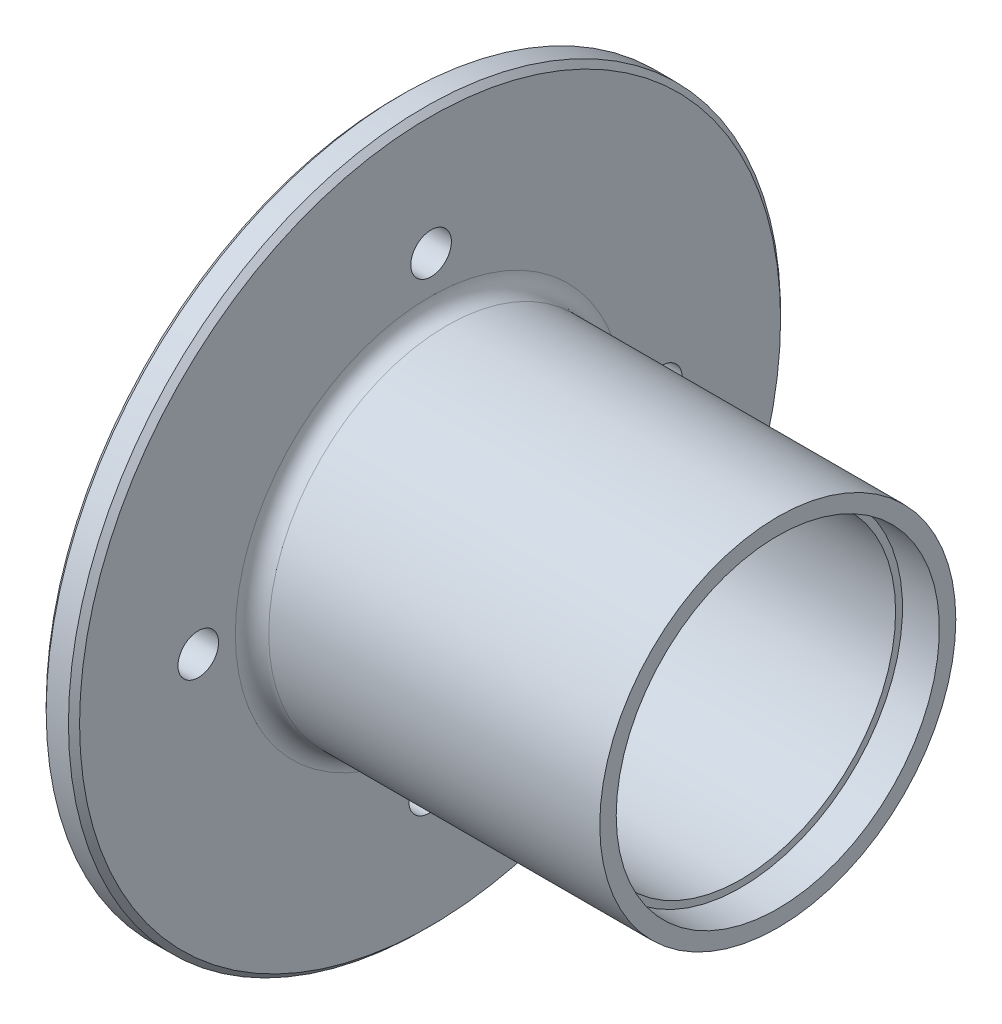
ISO-10303-21;
HEADER;
FILE_DESCRIPTION(('STEP AP214'),'2;1');
FILE_NAME('part.step','',(''),(''),'','','');
FILE_SCHEMA(('AUTOMOTIVE_DESIGN { 1 0 10303 214 1 1 1 1 }'));
ENDSEC;
DATA;
#1=APPLICATION_CONTEXT('core data for automotive mechanical design processes');
#2=APPLICATION_PROTOCOL_DEFINITION('international standard','automotive_design',2000,#1);
#3=PRODUCT_CONTEXT('',#1,'mechanical');
#4=PRODUCT('Part','Part','',(#3));
#5=PRODUCT_RELATED_PRODUCT_CATEGORY('part','',(#4));
#6=PRODUCT_DEFINITION_FORMATION('','',#4);
#7=PRODUCT_DEFINITION_CONTEXT('part definition',#1,'design');
#8=PRODUCT_DEFINITION('design','',#6,#7);
#9=PRODUCT_DEFINITION_SHAPE('','',#8);
#10=(LENGTH_UNIT() NAMED_UNIT(*) SI_UNIT(.MILLI.,.METRE.));
#11=(NAMED_UNIT(*) PLANE_ANGLE_UNIT() SI_UNIT($,.RADIAN.));
#12=(NAMED_UNIT(*) SI_UNIT($,.STERADIAN.) SOLID_ANGLE_UNIT());
#13=UNCERTAINTY_MEASURE_WITH_UNIT(LENGTH_MEASURE(1.E-05),#10,'distance_accuracy_value','');
#14=(GEOMETRIC_REPRESENTATION_CONTEXT(3) GLOBAL_UNCERTAINTY_ASSIGNED_CONTEXT((#13)) GLOBAL_UNIT_ASSIGNED_CONTEXT((#10,
#11,#12)) REPRESENTATION_CONTEXT('',''));
#15=CARTESIAN_POINT('',(0.,0.,0.));
#16=DIRECTION('',(0.,0.,1.));
#17=DIRECTION('',(1.,0.,0.));
#18=AXIS2_PLACEMENT_3D('',#15,#16,#17);
#19=CARTESIAN_POINT('',(0.,0.,0.));
#20=DIRECTION('',(-1.,0.,0.));
#21=DIRECTION('',(0.,0.,1.));
#22=AXIS2_PLACEMENT_3D('',#19,#20,#21);
#23=CONICAL_SURFACE('',#22,17.143351135521,0.767642261232655);
#24=CARTESIAN_POINT('',(4.7625,0.,0.));
#25=DIRECTION('',(-1.,0.,0.));
#26=DIRECTION('',(0.,0.,1.));
#27=AXIS2_PLACEMENT_3D('',#24,#25,#26);
#28=CIRCLE('',#27,12.5470426882416);
#29=CARTESIAN_POINT('',(4.7625,0.,12.5470426882416));
#30=VERTEX_POINT('',#29);
#31=EDGE_CURVE('E10',#30,#30,#28,.T.);
#32=ORIENTED_EDGE('',*,*,#31,.F.);
#33=EDGE_LOOP('',(#32));
#34=FACE_BOUND('',#33,.T.);
#35=CARTESIAN_POINT('',(0.,0.,0.));
#36=DIRECTION('',(-1.,0.,0.));
#37=DIRECTION('',(0.,0.,1.));
#38=AXIS2_PLACEMENT_3D('',#35,#36,#37);
#39=CIRCLE('',#38,17.143351135521);
#40=CARTESIAN_POINT('',(0.,0.,17.143351135521));
#41=VERTEX_POINT('',#40);
#42=EDGE_CURVE('E85',#41,#41,#39,.T.);
#43=ORIENTED_EDGE('',*,*,#42,.T.);
#44=EDGE_LOOP('',(#43));
#45=FACE_BOUND('',#44,.T.);
#46=ADVANCED_FACE('F36',(#34,#45),#23,.F.);
#47=CARTESIAN_POINT('',(4.7625,12.5470426882416,0.));
#48=DIRECTION('',(-1.,0.,0.));
#49=DIRECTION('',(0.,0.,1.));
#50=AXIS2_PLACEMENT_3D('',#47,#48,#49);
#51=PLANE('',#50);
#52=CARTESIAN_POINT('',(4.7625,0.,0.));
#53=DIRECTION('',(-1.,0.,0.));
#54=DIRECTION('',(0.,0.,1.));
#55=AXIS2_PLACEMENT_3D('',#52,#53,#54);
#56=CIRCLE('',#55,17.143351135521);
#57=CARTESIAN_POINT('',(4.7625,0.,17.143351135521));
#58=VERTEX_POINT('',#57);
#59=EDGE_CURVE('E42',#58,#58,#56,.T.);
#60=ORIENTED_EDGE('',*,*,#59,.F.);
#61=EDGE_LOOP('',(#60));
#62=FACE_BOUND('',#61,.T.);
#63=ORIENTED_EDGE('',*,*,#31,.T.);
#64=EDGE_LOOP('',(#63));
#65=FACE_BOUND('',#64,.T.);
#66=ADVANCED_FACE('F200',(#62,#65),#51,.F.);
#67=CARTESIAN_POINT('',(207.498884421243,0.,0.));
#68=DIRECTION('',(-1.,0.,0.));
#69=DIRECTION('',(0.,0.,1.));
#70=AXIS2_PLACEMENT_3D('',#67,#68,#69);
#71=CYLINDRICAL_SURFACE('',#70,17.143351135521);
#72=CARTESIAN_POINT('',(20.2028356501082,0.,0.));
#73=DIRECTION('',(-1.,0.,0.));
#74=DIRECTION('',(0.,0.,1.));
#75=AXIS2_PLACEMENT_3D('',#72,#73,#74);
#76=CIRCLE('',#75,17.143351135521);
#77=CARTESIAN_POINT('',(20.2028356501082,0.,17.143351135521));
#78=VERTEX_POINT('',#77);
#79=EDGE_CURVE('E46',#78,#78,#76,.T.);
#80=ORIENTED_EDGE('',*,*,#79,.F.);
#81=EDGE_LOOP('',(#80));
#82=FACE_BOUND('',#81,.T.);
#83=ORIENTED_EDGE('',*,*,#59,.T.);
#84=EDGE_LOOP('',(#83));
#85=FACE_BOUND('',#84,.T.);
#86=ADVANCED_FACE('F195',(#82,#85),#71,.F.);
#87=CARTESIAN_POINT('',(20.2028356501082,17.143351135521,0.));
#88=DIRECTION('',(-1.,0.,0.));
#89=DIRECTION('',(0.,0.,1.));
#90=AXIS2_PLACEMENT_3D('',#87,#88,#89);
#91=PLANE('',#90);
#92=CARTESIAN_POINT('',(20.2028356501082,0.,0.));
#93=DIRECTION('',(-1.,0.,0.));
#94=DIRECTION('',(0.,0.,1.));
#95=AXIS2_PLACEMENT_3D('',#92,#93,#94);
#96=CIRCLE('',#95,22.067968077904);
#97=CARTESIAN_POINT('',(20.2028356501082,0.,22.067968077904));
#98=VERTEX_POINT('',#97);
#99=EDGE_CURVE('E50',#98,#98,#96,.T.);
#100=ORIENTED_EDGE('',*,*,#99,.F.);
#101=EDGE_LOOP('',(#100));
#102=FACE_BOUND('',#101,.T.);
#103=ORIENTED_EDGE('',*,*,#79,.T.);
#104=EDGE_LOOP('',(#103));
#105=FACE_BOUND('',#104,.T.);
#106=ADVANCED_FACE('F189',(#102,#105),#91,.F.);
#107=CARTESIAN_POINT('',(207.498884421243,0.,0.));
#108=DIRECTION('',(-1.,0.,0.));
#109=DIRECTION('',(0.,0.,1.));
#110=AXIS2_PLACEMENT_3D('',#107,#108,#109);
#111=CYLINDRICAL_SURFACE('',#110,22.067968077904);
#112=CARTESIAN_POINT('',(49.1123998924168,0.,0.));
#113=DIRECTION('',(-1.,0.,0.));
#114=DIRECTION('',(0.,0.,1.));
#115=AXIS2_PLACEMENT_3D('',#112,#113,#114);
#116=CIRCLE('',#115,22.067968077904);
#117=CARTESIAN_POINT('',(49.1123998924168,0.,22.067968077904));
#118=VERTEX_POINT('',#117);
#119=EDGE_CURVE('E55',#118,#118,#116,.T.);
#120=ORIENTED_EDGE('',*,*,#119,.F.);
#121=EDGE_LOOP('',(#120));
#122=FACE_BOUND('',#121,.T.);
#123=ORIENTED_EDGE('',*,*,#99,.T.);
#124=EDGE_LOOP('',(#123));
#125=FACE_BOUND('',#124,.T.);
#126=ADVANCED_FACE('F183',(#122,#125),#111,.F.);
#127=CARTESIAN_POINT('',(49.1123998924168,22.067968077904,0.));
#128=DIRECTION('',(-1.,0.,0.));
#129=DIRECTION('',(0.,0.,1.));
#130=AXIS2_PLACEMENT_3D('',#127,#128,#129);
#131=PLANE('',#130);
#132=CARTESIAN_POINT('',(49.1123998924168,0.,0.));
#133=DIRECTION('',(-1.,0.,0.));
#134=DIRECTION('',(0.,0.,1.));
#135=AXIS2_PLACEMENT_3D('',#132,#133,#134);
#136=CIRCLE('',#135,23.0528912698023);
#137=CARTESIAN_POINT('',(49.1123998924168,0.,23.0528912698023));
#138=VERTEX_POINT('',#137);
#139=EDGE_CURVE('E58',#138,#138,#136,.T.);
#140=ORIENTED_EDGE('',*,*,#139,.F.);
#141=EDGE_LOOP('',(#140));
#142=FACE_BOUND('',#141,.T.);
#143=ORIENTED_EDGE('',*,*,#119,.T.);
#144=EDGE_LOOP('',(#143));
#145=FACE_BOUND('',#144,.T.);
#146=ADVANCED_FACE('F177',(#142,#145),#131,.F.);
#147=CARTESIAN_POINT('',(207.498884421243,0.,0.));
#148=DIRECTION('',(-1.,0.,0.));
#149=DIRECTION('',(0.,0.,1.));
#150=AXIS2_PLACEMENT_3D('',#147,#148,#149);
#151=CYLINDRICAL_SURFACE('',#150,23.0528912698023);
#152=CARTESIAN_POINT('',(54.3686846813072,0.,0.));
#153=DIRECTION('',(-1.,0.,0.));
#154=DIRECTION('',(0.,0.,1.));
#155=AXIS2_PLACEMENT_3D('',#152,#153,#154);
#156=CIRCLE('',#155,23.0528912698023);
#157=CARTESIAN_POINT('',(54.3686846813072,0.,23.0528912698023));
#158=VERTEX_POINT('',#157);
#159=EDGE_CURVE('E61',#158,#158,#156,.T.);
#160=ORIENTED_EDGE('',*,*,#159,.F.);
#161=EDGE_LOOP('',(#160));
#162=FACE_BOUND('',#161,.T.);
#163=ORIENTED_EDGE('',*,*,#139,.T.);
#164=EDGE_LOOP('',(#163));
#165=FACE_BOUND('',#164,.T.);
#166=ADVANCED_FACE('F171',(#162,#165),#151,.F.);
#167=CARTESIAN_POINT('',(54.3686846813072,23.0528912698023,0.));
#168=DIRECTION('',(-1.,0.,0.));
#169=DIRECTION('',(0.,0.,1.));
#170=AXIS2_PLACEMENT_3D('',#167,#168,#169);
#171=PLANE('',#170);
#172=CARTESIAN_POINT('',(54.3686846813072,0.,0.));
#173=DIRECTION('',(-1.,0.,0.));
#174=DIRECTION('',(0.,0.,1.));
#175=AXIS2_PLACEMENT_3D('',#172,#173,#174);
#176=CIRCLE('',#175,25.4);
#177=CARTESIAN_POINT('',(54.3686846813072,0.,25.4));
#178=VERTEX_POINT('',#177);
#179=EDGE_CURVE('E64',#178,#178,#176,.T.);
#180=ORIENTED_EDGE('',*,*,#179,.F.);
#181=EDGE_LOOP('',(#180));
#182=FACE_BOUND('',#181,.T.);
#183=ORIENTED_EDGE('',*,*,#159,.T.);
#184=EDGE_LOOP('',(#183));
#185=FACE_BOUND('',#184,.T.);
#186=ADVANCED_FACE('F165',(#182,#185),#171,.F.);
#187=CARTESIAN_POINT('',(207.498884421243,0.,0.));
#188=DIRECTION('',(-1.,0.,0.));
#189=DIRECTION('',(0.,0.,1.));
#190=AXIS2_PLACEMENT_3D('',#187,#188,#189);
#191=CYLINDRICAL_SURFACE('',#190,25.3999999999999);
#192=CARTESIAN_POINT('',(7.14375,0.,0.));
#193=DIRECTION('',(-1.,0.,0.));
#194=DIRECTION('',(0.,0.,1.));
#195=AXIS2_PLACEMENT_3D('',#192,#193,#194);
#196=CIRCLE('',#195,25.3999999999999);
#197=CARTESIAN_POINT('',(7.14375,0.,25.3999999999999));
#198=VERTEX_POINT('',#197);
#199=EDGE_CURVE('E67',#198,#198,#196,.T.);
#200=ORIENTED_EDGE('',*,*,#199,.F.);
#201=EDGE_LOOP('',(#200));
#202=FACE_BOUND('',#201,.T.);
#203=ORIENTED_EDGE('',*,*,#179,.T.);
#204=EDGE_LOOP('',(#203));
#205=FACE_BOUND('',#204,.T.);
#206=ADVANCED_FACE('F159',(#202,#205),#191,.T.);
#207=CARTESIAN_POINT('',(7.14375,0.,0.));
#208=DIRECTION('',(-1.,0.,0.));
#209=DIRECTION('',(0.,0.,1.));
#210=AXIS2_PLACEMENT_3D('',#207,#208,#209);
#211=TOROIDAL_SURFACE('',#210,27.7812499999999,2.38125);
#212=CARTESIAN_POINT('',(4.7625,0.,0.));
#213=DIRECTION('',(-1.,0.,0.));
#214=DIRECTION('',(0.,0.,1.));
#215=AXIS2_PLACEMENT_3D('',#212,#213,#214);
#216=CIRCLE('',#215,27.7812499999999);
#217=CARTESIAN_POINT('',(4.7625,0.,27.7812499999999));
#218=VERTEX_POINT('',#217);
#219=EDGE_CURVE('E70',#218,#218,#216,.T.);
#220=ORIENTED_EDGE('',*,*,#219,.F.);
#221=EDGE_LOOP('',(#220));
#222=FACE_BOUND('',#221,.T.);
#223=ORIENTED_EDGE('',*,*,#199,.T.);
#224=EDGE_LOOP('',(#223));
#225=FACE_BOUND('',#224,.T.);
#226=ADVANCED_FACE('F152',(#222,#225),#211,.F.);
#227=CARTESIAN_POINT('',(4.7625,27.7812499999999,0.));
#228=DIRECTION('',(-1.,0.,0.));
#229=DIRECTION('',(0.,0.,1.));
#230=AXIS2_PLACEMENT_3D('',#227,#228,#229);
#231=PLANE('',#230);
#232=CARTESIAN_POINT('',(4.7625,0.14697334332829,33.069002248787));
#233=DIRECTION('',(-1.,0.,0.));
#234=DIRECTION('',(0.,0.,1.));
#235=AXIS2_PLACEMENT_3D('',#232,#233,#234);
#236=CIRCLE('',#235,2.89559999999999);
#237=CARTESIAN_POINT('',(4.7625,0.14697334332829,35.964602248787));
#238=VERTEX_POINT('',#237);
#239=EDGE_CURVE('E106',#238,#238,#236,.T.);
#240=ORIENTED_EDGE('',*,*,#239,.T.);
#241=EDGE_LOOP('',(#240));
#242=FACE_BOUND('',#241,.T.);
#243=CARTESIAN_POINT('',(4.7625,-33.069002248787,0.146973343328175));
#244=DIRECTION('',(-1.,0.,0.));
#245=DIRECTION('',(0.,0.,1.));
#246=AXIS2_PLACEMENT_3D('',#243,#244,#245);
#247=CIRCLE('',#246,2.89559999999999);
#248=CARTESIAN_POINT('',(4.7625,-33.069002248787,3.04257334332816));
#249=VERTEX_POINT('',#248);
#250=EDGE_CURVE('E100',#249,#249,#247,.T.);
#251=ORIENTED_EDGE('',*,*,#250,.T.);
#252=EDGE_LOOP('',(#251));
#253=FACE_BOUND('',#252,.T.);
#254=CARTESIAN_POINT('',(4.7625,-0.14697334332806,-33.069002248787));
#255=DIRECTION('',(-1.,0.,0.));
#256=DIRECTION('',(0.,0.,1.));
#257=AXIS2_PLACEMENT_3D('',#254,#255,#256);
#258=CIRCLE('',#257,2.89559999999999);
#259=CARTESIAN_POINT('',(4.7625,-0.14697334332806,-30.173402248787));
#260=VERTEX_POINT('',#259);
#261=EDGE_CURVE('E94',#260,#260,#258,.T.);
#262=ORIENTED_EDGE('',*,*,#261,.T.);
#263=EDGE_LOOP('',(#262));
#264=FACE_BOUND('',#263,.T.);
#265=CARTESIAN_POINT('',(4.7625,33.069002248787,-0.146973343327944));
#266=DIRECTION('',(-1.,0.,0.));
#267=DIRECTION('',(0.,0.,1.));
#268=AXIS2_PLACEMENT_3D('',#265,#266,#267);
#269=CIRCLE('',#268,2.89559999999999);
#270=CARTESIAN_POINT('',(4.7625,33.069002248787,2.74862665667205));
#271=VERTEX_POINT('',#270);
#272=EDGE_CURVE('E88',#271,#271,#269,.T.);
#273=ORIENTED_EDGE('',*,*,#272,.T.);
#274=EDGE_LOOP('',(#273));
#275=FACE_BOUND('',#274,.T.);
#276=CARTESIAN_POINT('',(4.7625,0.,0.));
#277=DIRECTION('',(-1.,0.,0.));
#278=DIRECTION('',(0.,0.,1.));
#279=AXIS2_PLACEMENT_3D('',#276,#277,#278);
#280=CIRCLE('',#279,50.00625);
#281=CARTESIAN_POINT('',(4.7625,0.,50.00625));
#282=VERTEX_POINT('',#281);
#283=EDGE_CURVE('E73',#282,#282,#280,.T.);
#284=ORIENTED_EDGE('',*,*,#283,.F.);
#285=EDGE_LOOP('',(#284));
#286=FACE_BOUND('',#285,.T.);
#287=ORIENTED_EDGE('',*,*,#219,.T.);
#288=EDGE_LOOP('',(#287));
#289=FACE_BOUND('',#288,.T.);
#290=ADVANCED_FACE('F146',(#242,#253,#264,#275,#286,#289),#231,.F.);
#291=CARTESIAN_POINT('',(4.7625,0.,0.));
#292=DIRECTION('',(-1.,0.,0.));
#293=DIRECTION('',(0.,0.,1.));
#294=AXIS2_PLACEMENT_3D('',#291,#292,#293);
#295=CONICAL_SURFACE('',#294,50.00625,0.785398163397431);
#296=CARTESIAN_POINT('',(3.96874999999999,0.,0.));
#297=DIRECTION('',(-1.,0.,0.));
#298=DIRECTION('',(0.,0.,1.));
#299=AXIS2_PLACEMENT_3D('',#296,#297,#298);
#300=CIRCLE('',#299,50.8);
#301=CARTESIAN_POINT('',(3.96874999999999,0.,50.8));
#302=VERTEX_POINT('',#301);
#303=EDGE_CURVE('E76',#302,#302,#300,.T.);
#304=ORIENTED_EDGE('',*,*,#303,.F.);
#305=EDGE_LOOP('',(#304));
#306=FACE_BOUND('',#305,.T.);
#307=ORIENTED_EDGE('',*,*,#283,.T.);
#308=EDGE_LOOP('',(#307));
#309=FACE_BOUND('',#308,.T.);
#310=ADVANCED_FACE('F140',(#306,#309),#295,.T.);
#311=CARTESIAN_POINT('',(207.498884421243,0.,0.));
#312=DIRECTION('',(-1.,0.,0.));
#313=DIRECTION('',(0.,0.,1.));
#314=AXIS2_PLACEMENT_3D('',#311,#312,#313);
#315=CYLINDRICAL_SURFACE('',#314,50.8);
#316=CARTESIAN_POINT('',(0.79375000000001,0.,0.));
#317=DIRECTION('',(-1.,0.,0.));
#318=DIRECTION('',(0.,0.,1.));
#319=AXIS2_PLACEMENT_3D('',#316,#317,#318);
#320=CIRCLE('',#319,50.8);
#321=CARTESIAN_POINT('',(0.79375000000001,0.,50.8));
#322=VERTEX_POINT('',#321);
#323=EDGE_CURVE('E79',#322,#322,#320,.T.);
#324=ORIENTED_EDGE('',*,*,#323,.F.);
#325=EDGE_LOOP('',(#324));
#326=FACE_BOUND('',#325,.T.);
#327=ORIENTED_EDGE('',*,*,#303,.T.);
#328=EDGE_LOOP('',(#327));
#329=FACE_BOUND('',#328,.T.);
#330=ADVANCED_FACE('F134',(#326,#329),#315,.T.);
#331=CARTESIAN_POINT('',(0.79375000000001,0.,0.));
#332=DIRECTION('',(1.,0.,0.));
#333=DIRECTION('',(0.,0.,-1.));
#334=AXIS2_PLACEMENT_3D('',#331,#332,#333);
#335=CONICAL_SURFACE('',#334,50.8,0.785398163397431);
#336=CARTESIAN_POINT('',(0.,0.,0.));
#337=DIRECTION('',(-1.,0.,0.));
#338=DIRECTION('',(0.,0.,1.));
#339=AXIS2_PLACEMENT_3D('',#336,#337,#338);
#340=CIRCLE('',#339,50.00625);
#341=CARTESIAN_POINT('',(0.,0.,50.00625));
#342=VERTEX_POINT('',#341);
#343=EDGE_CURVE('E82',#342,#342,#340,.T.);
#344=ORIENTED_EDGE('',*,*,#343,.F.);
#345=EDGE_LOOP('',(#344));
#346=FACE_BOUND('',#345,.T.);
#347=ORIENTED_EDGE('',*,*,#323,.T.);
#348=EDGE_LOOP('',(#347));
#349=FACE_BOUND('',#348,.T.);
#350=ADVANCED_FACE('F120',(#346,#349),#335,.T.);
#351=CARTESIAN_POINT('',(0.,50.00625,0.));
#352=DIRECTION('',(1.,0.,0.));
#353=DIRECTION('',(0.,0.,-1.));
#354=AXIS2_PLACEMENT_3D('',#351,#352,#353);
#355=PLANE('',#354);
#356=CARTESIAN_POINT('',(0.,0.14697334332829,33.069002248787));
#357=DIRECTION('',(-1.,0.,0.));
#358=DIRECTION('',(0.,0.,1.));
#359=AXIS2_PLACEMENT_3D('',#356,#357,#358);
#360=CIRCLE('',#359,2.89559999999999);
#361=CARTESIAN_POINT('',(0.,0.14697334332829,35.964602248787));
#362=VERTEX_POINT('',#361);
#363=EDGE_CURVE('E109',#362,#362,#360,.T.);
#364=ORIENTED_EDGE('',*,*,#363,.F.);
#365=EDGE_LOOP('',(#364));
#366=FACE_BOUND('',#365,.T.);
#367=CARTESIAN_POINT('',(0.,-33.069002248787,0.146973343328175));
#368=DIRECTION('',(-1.,0.,0.));
#369=DIRECTION('',(0.,0.,1.));
#370=AXIS2_PLACEMENT_3D('',#367,#368,#369);
#371=CIRCLE('',#370,2.89559999999999);
#372=CARTESIAN_POINT('',(0.,-33.069002248787,3.04257334332816));
#373=VERTEX_POINT('',#372);
#374=EDGE_CURVE('E103',#373,#373,#371,.T.);
#375=ORIENTED_EDGE('',*,*,#374,.F.);
#376=EDGE_LOOP('',(#375));
#377=FACE_BOUND('',#376,.T.);
#378=CARTESIAN_POINT('',(0.,-0.14697334332806,-33.069002248787));
#379=DIRECTION('',(-1.,0.,0.));
#380=DIRECTION('',(0.,0.,1.));
#381=AXIS2_PLACEMENT_3D('',#378,#379,#380);
#382=CIRCLE('',#381,2.89559999999999);
#383=CARTESIAN_POINT('',(0.,-0.14697334332806,-30.173402248787));
#384=VERTEX_POINT('',#383);
#385=EDGE_CURVE('E97',#384,#384,#382,.T.);
#386=ORIENTED_EDGE('',*,*,#385,.F.);
#387=EDGE_LOOP('',(#386));
#388=FACE_BOUND('',#387,.T.);
#389=CARTESIAN_POINT('',(0.,33.069002248787,-0.146973343327944));
#390=DIRECTION('',(-1.,0.,0.));
#391=DIRECTION('',(0.,0.,1.));
#392=AXIS2_PLACEMENT_3D('',#389,#390,#391);
#393=CIRCLE('',#392,2.89559999999999);
#394=CARTESIAN_POINT('',(0.,33.069002248787,2.74862665667205));
#395=VERTEX_POINT('',#394);
#396=EDGE_CURVE('E91',#395,#395,#393,.T.);
#397=ORIENTED_EDGE('',*,*,#396,.F.);
#398=EDGE_LOOP('',(#397));
#399=FACE_BOUND('',#398,.T.);
#400=ORIENTED_EDGE('',*,*,#42,.F.);
#401=EDGE_LOOP('',(#400));
#402=FACE_BOUND('',#401,.T.);
#403=ORIENTED_EDGE('',*,*,#343,.T.);
#404=EDGE_LOOP('',(#403));
#405=FACE_BOUND('',#404,.T.);
#406=ADVANCED_FACE('F116',(#366,#377,#388,#399,#402,#405),#355,.F.);
#407=CARTESIAN_POINT('',(0.,33.069002248787,-0.146973343327944));
#408=DIRECTION('',(-1.,0.,0.));
#409=DIRECTION('',(0.,0.,1.));
#410=AXIS2_PLACEMENT_3D('',#407,#408,#409);
#411=CYLINDRICAL_SURFACE('',#410,2.89559999999999);
#412=ORIENTED_EDGE('',*,*,#396,.T.);
#413=EDGE_LOOP('',(#412));
#414=FACE_BOUND('',#413,.T.);
#415=ORIENTED_EDGE('',*,*,#272,.F.);
#416=EDGE_LOOP('',(#415));
#417=FACE_BOUND('',#416,.T.);
#418=ADVANCED_FACE('F119',(#414,#417),#411,.F.);
#419=CARTESIAN_POINT('',(0.,-0.14697334332806,-33.069002248787));
#420=DIRECTION('',(-1.,0.,0.));
#421=DIRECTION('',(0.,0.,1.));
#422=AXIS2_PLACEMENT_3D('',#419,#420,#421);
#423=CYLINDRICAL_SURFACE('',#422,2.89559999999999);
#424=ORIENTED_EDGE('',*,*,#385,.T.);
#425=EDGE_LOOP('',(#424));
#426=FACE_BOUND('',#425,.T.);
#427=ORIENTED_EDGE('',*,*,#261,.F.);
#428=EDGE_LOOP('',(#427));
#429=FACE_BOUND('',#428,.T.);
#430=ADVANCED_FACE('F290',(#426,#429),#423,.F.);
#431=CARTESIAN_POINT('',(0.,-33.069002248787,0.146973343328175));
#432=DIRECTION('',(-1.,0.,0.));
#433=DIRECTION('',(0.,0.,1.));
#434=AXIS2_PLACEMENT_3D('',#431,#432,#433);
#435=CYLINDRICAL_SURFACE('',#434,2.89559999999999);
#436=ORIENTED_EDGE('',*,*,#374,.T.);
#437=EDGE_LOOP('',(#436));
#438=FACE_BOUND('',#437,.T.);
#439=ORIENTED_EDGE('',*,*,#250,.F.);
#440=EDGE_LOOP('',(#439));
#441=FACE_BOUND('',#440,.T.);
#442=ADVANCED_FACE('F310',(#438,#441),#435,.F.);
#443=CARTESIAN_POINT('',(0.,0.14697334332829,33.069002248787));
#444=DIRECTION('',(-1.,0.,0.));
#445=DIRECTION('',(0.,0.,1.));
#446=AXIS2_PLACEMENT_3D('',#443,#444,#445);
#447=CYLINDRICAL_SURFACE('',#446,2.89559999999999);
#448=ORIENTED_EDGE('',*,*,#363,.T.);
#449=EDGE_LOOP('',(#448));
#450=FACE_BOUND('',#449,.T.);
#451=ORIENTED_EDGE('',*,*,#239,.F.);
#452=EDGE_LOOP('',(#451));
#453=FACE_BOUND('',#452,.T.);
#454=ADVANCED_FACE('F113',(#450,#453),#447,.F.);
#455=CLOSED_SHELL('',(#46,#66,#86,#106,#126,#146,#166,#186,#206,#226,#290,#310,#330,#350,#406,
#418,#430,#442,#454));
#456=MANIFOLD_SOLID_BREP('B2',#455);
#457=ADVANCED_BREP_SHAPE_REPRESENTATION('',(#18,#456),#14);
#458=SHAPE_DEFINITION_REPRESENTATION(#9,#457);
ENDSEC;
END-ISO-10303-21;
